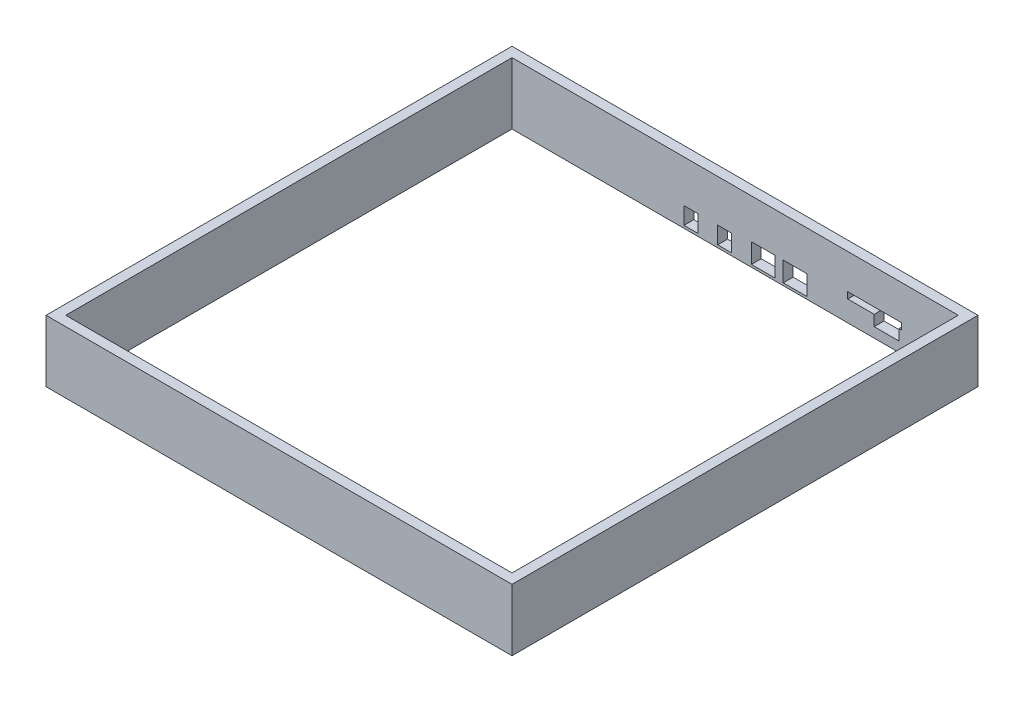
ISO-10303-21;
HEADER;
FILE_DESCRIPTION(('STEP AP214'),'2;1');
FILE_NAME('part.step','',(''),(''),'','','');
FILE_SCHEMA(('AUTOMOTIVE_DESIGN { 1 0 10303 214 1 1 1 1 }'));
ENDSEC;
DATA;
#1=APPLICATION_CONTEXT('core data for automotive mechanical design processes');
#2=APPLICATION_PROTOCOL_DEFINITION('international standard','automotive_design',2000,#1);
#3=PRODUCT_CONTEXT('',#1,'mechanical');
#4=PRODUCT('Part','Part','',(#3));
#5=PRODUCT_RELATED_PRODUCT_CATEGORY('part','',(#4));
#6=PRODUCT_DEFINITION_FORMATION('','',#4);
#7=PRODUCT_DEFINITION_CONTEXT('part definition',#1,'design');
#8=PRODUCT_DEFINITION('design','',#6,#7);
#9=PRODUCT_DEFINITION_SHAPE('','',#8);
#10=(LENGTH_UNIT() NAMED_UNIT(*) SI_UNIT(.MILLI.,.METRE.));
#11=(NAMED_UNIT(*) PLANE_ANGLE_UNIT() SI_UNIT($,.RADIAN.));
#12=(NAMED_UNIT(*) SI_UNIT($,.STERADIAN.) SOLID_ANGLE_UNIT());
#13=UNCERTAINTY_MEASURE_WITH_UNIT(LENGTH_MEASURE(1.E-05),#10,'distance_accuracy_value','');
#14=(GEOMETRIC_REPRESENTATION_CONTEXT(3) GLOBAL_UNCERTAINTY_ASSIGNED_CONTEXT((#13)) GLOBAL_UNIT_ASSIGNED_CONTEXT((#10,
#11,#12)) REPRESENTATION_CONTEXT('',''));
#15=CARTESIAN_POINT('',(0.,0.,0.));
#16=DIRECTION('',(0.,0.,1.));
#17=DIRECTION('',(1.,0.,0.));
#18=AXIS2_PLACEMENT_3D('',#15,#16,#17);
#19=CARTESIAN_POINT('',(-150.,39.8272,-150.));
#20=DIRECTION('',(0.,0.,1.));
#21=DIRECTION('',(1.,0.,0.));
#22=AXIS2_PLACEMENT_3D('',#19,#20,#21);
#23=PLANE('',#22);
#24=DIRECTION('',(0.,-1.,0.));
#25=VECTOR('',#24,1.);
#26=CARTESIAN_POINT('',(-32.9574289216493,12.6748,-150.));
#27=LINE('',#26,#25);
#28=CARTESIAN_POINT('',(-32.9574289216493,12.6748,-150.));
#29=VERTEX_POINT('',#28);
#30=CARTESIAN_POINT('',(-32.9574289216493,1.67480000000004,-150.));
#31=VERTEX_POINT('',#30);
#32=EDGE_CURVE('E488',#29,#31,#27,.T.);
#33=ORIENTED_EDGE('',*,*,#32,.T.);
#34=DIRECTION('',(-1.,0.,0.));
#35=VECTOR('',#34,1.);
#36=CARTESIAN_POINT('',(-23.9574289216493,1.67480000000004,-150.));
#37=LINE('',#36,#35);
#38=CARTESIAN_POINT('',(-23.9574289216493,1.67480000000004,-150.));
#39=VERTEX_POINT('',#38);
#40=EDGE_CURVE('E56',#39,#31,#37,.T.);
#41=ORIENTED_EDGE('',*,*,#40,.F.);
#42=DIRECTION('',(0.,-1.,0.));
#43=VECTOR('',#42,1.);
#44=CARTESIAN_POINT('',(-23.9574289216493,12.6748,-150.));
#45=LINE('',#44,#43);
#46=CARTESIAN_POINT('',(-23.9574289216493,12.6748,-150.));
#47=VERTEX_POINT('',#46);
#48=EDGE_CURVE('E473',#47,#39,#45,.T.);
#49=ORIENTED_EDGE('',*,*,#48,.F.);
#50=DIRECTION('',(-1.,0.,0.));
#51=VECTOR('',#50,1.);
#52=CARTESIAN_POINT('',(-23.9574289216493,12.6748,-150.));
#53=LINE('',#52,#51);
#54=EDGE_CURVE('E484',#47,#29,#53,.T.);
#55=ORIENTED_EDGE('',*,*,#54,.T.);
#56=EDGE_LOOP('',(#33,#41,#49,#55));
#57=FACE_BOUND('',#56,.T.);
#58=DIRECTION('',(0.,-1.,0.));
#59=VECTOR('',#58,1.);
#60=CARTESIAN_POINT('',(30.9684484780568,0.,-150.));
#61=LINE('',#60,#59);
#62=CARTESIAN_POINT('',(30.9684484780568,14.2748,-150.));
#63=VERTEX_POINT('',#62);
#64=CARTESIAN_POINT('',(30.9684484780568,1.5748,-150.));
#65=VERTEX_POINT('',#64);
#66=EDGE_CURVE('E325',#63,#65,#61,.T.);
#67=ORIENTED_EDGE('',*,*,#66,.T.);
#68=DIRECTION('',(-1.,0.,0.));
#69=VECTOR('',#68,1.);
#70=CARTESIAN_POINT('',(0.,1.5748,-150.));
#71=LINE('',#70,#69);
#72=CARTESIAN_POINT('',(46.2684484780568,1.5748,-150.));
#73=VERTEX_POINT('',#72);
#74=EDGE_CURVE('E309',#73,#65,#71,.T.);
#75=ORIENTED_EDGE('',*,*,#74,.F.);
#76=DIRECTION('',(0.,-1.,0.));
#77=VECTOR('',#76,1.);
#78=CARTESIAN_POINT('',(46.2684484780568,0.,-150.));
#79=LINE('',#78,#77);
#80=CARTESIAN_POINT('',(46.2684484780568,14.2748,-150.));
#81=VERTEX_POINT('',#80);
#82=EDGE_CURVE('E1004',#81,#73,#79,.T.);
#83=ORIENTED_EDGE('',*,*,#82,.F.);
#84=DIRECTION('',(-1.,0.,0.));
#85=VECTOR('',#84,1.);
#86=CARTESIAN_POINT('',(0.,14.2748,-150.));
#87=LINE('',#86,#85);
#88=EDGE_CURVE('E1007',#81,#63,#87,.T.);
#89=ORIENTED_EDGE('',*,*,#88,.T.);
#90=EDGE_LOOP('',(#67,#75,#83,#89));
#91=FACE_BOUND('',#90,.T.);
#92=DIRECTION('',(-1.,0.,0.));
#93=VECTOR('',#92,1.);
#94=CARTESIAN_POINT('',(-150.,0.,-150.));
#95=LINE('',#94,#93);
#96=CARTESIAN_POINT('',(150.,0.,-150.));
#97=VERTEX_POINT('',#96);
#98=CARTESIAN_POINT('',(-150.,0.,-150.));
#99=VERTEX_POINT('',#98);
#100=EDGE_CURVE('E609',#97,#99,#95,.T.);
#101=ORIENTED_EDGE('',*,*,#100,.T.);
#102=DIRECTION('',(0.,-1.,0.));
#103=VECTOR('',#102,1.);
#104=CARTESIAN_POINT('',(-150.,39.8272,-150.));
#105=LINE('',#104,#103);
#106=CARTESIAN_POINT('',(-150.,39.8272,-150.));
#107=VERTEX_POINT('',#106);
#108=EDGE_CURVE('E47',#107,#99,#105,.T.);
#109=ORIENTED_EDGE('',*,*,#108,.F.);
#110=DIRECTION('',(-1.,0.,0.));
#111=VECTOR('',#110,1.);
#112=CARTESIAN_POINT('',(-150.,39.8272,-150.));
#113=LINE('',#112,#111);
#114=CARTESIAN_POINT('',(150.,39.8272,-150.));
#115=VERTEX_POINT('',#114);
#116=EDGE_CURVE('E595',#115,#107,#113,.T.);
#117=ORIENTED_EDGE('',*,*,#116,.F.);
#118=DIRECTION('',(0.,-1.,0.));
#119=VECTOR('',#118,1.);
#120=CARTESIAN_POINT('',(150.,39.8272,-150.));
#121=LINE('',#120,#119);
#122=EDGE_CURVE('E11',#115,#97,#121,.T.);
#123=ORIENTED_EDGE('',*,*,#122,.T.);
#124=EDGE_LOOP('',(#101,#109,#117,#123));
#125=FACE_BOUND('',#124,.T.);
#126=DIRECTION('',(0.,-1.,0.));
#127=VECTOR('',#126,1.);
#128=CARTESIAN_POINT('',(10.4425710783508,0.,-150.));
#129=LINE('',#128,#127);
#130=CARTESIAN_POINT('',(10.4425710783508,14.2748,-150.));
#131=VERTEX_POINT('',#130);
#132=CARTESIAN_POINT('',(10.4425710783508,1.5748,-150.));
#133=VERTEX_POINT('',#132);
#134=EDGE_CURVE('E515',#131,#133,#129,.T.);
#135=ORIENTED_EDGE('',*,*,#134,.T.);
#136=DIRECTION('',(-1.,0.,0.));
#137=VECTOR('',#136,1.);
#138=CARTESIAN_POINT('',(0.,1.5748,-150.));
#139=LINE('',#138,#137);
#140=CARTESIAN_POINT('',(25.7425710783508,1.5748,-150.));
#141=VERTEX_POINT('',#140);
#142=EDGE_CURVE('E527',#141,#133,#139,.T.);
#143=ORIENTED_EDGE('',*,*,#142,.F.);
#144=DIRECTION('',(0.,-1.,0.));
#145=VECTOR('',#144,1.);
#146=CARTESIAN_POINT('',(25.7425710783508,0.,-150.));
#147=LINE('',#146,#145);
#148=CARTESIAN_POINT('',(25.7425710783508,14.2748,-150.));
#149=VERTEX_POINT('',#148);
#150=EDGE_CURVE('E523',#149,#141,#147,.T.);
#151=ORIENTED_EDGE('',*,*,#150,.F.);
#152=DIRECTION('',(-1.,0.,0.));
#153=VECTOR('',#152,1.);
#154=CARTESIAN_POINT('',(0.,14.2748,-150.));
#155=LINE('',#154,#153);
#156=EDGE_CURVE('E519',#149,#131,#155,.T.);
#157=ORIENTED_EDGE('',*,*,#156,.T.);
#158=EDGE_LOOP('',(#135,#143,#151,#157));
#159=FACE_BOUND('',#158,.T.);
#160=DIRECTION('',(0.,-1.,0.));
#161=VECTOR('',#160,1.);
#162=CARTESIAN_POINT('',(107.152019667205,0.,-150.));
#163=LINE('',#162,#161);
#164=CARTESIAN_POINT('',(107.152019667205,17.418810742305,-150.));
#165=VERTEX_POINT('',#164);
#166=CARTESIAN_POINT('',(107.152019667205,13.305953258215,-150.));
#167=VERTEX_POINT('',#166);
#168=EDGE_CURVE('E398',#165,#167,#163,.T.);
#169=ORIENTED_EDGE('',*,*,#168,.F.);
#170=DIRECTION('',(1.,0.,0.));
#171=VECTOR('',#170,1.);
#172=CARTESIAN_POINT('',(0.,17.418810742305,-150.));
#173=LINE('',#172,#171);
#174=CARTESIAN_POINT('',(72.497624125665,17.418810742305,-150.));
#175=VERTEX_POINT('',#174);
#176=EDGE_CURVE('E348',#175,#165,#173,.T.);
#177=ORIENTED_EDGE('',*,*,#176,.F.);
#178=DIRECTION('',(-1.58589503645686E-13,-1.,0.));
#179=VECTOR('',#178,1.);
#180=CARTESIAN_POINT('',(72.4976241256623,-1.14973622255803E-11,-150.));
#181=LINE('',#180,#179);
#182=CARTESIAN_POINT('',(72.4976241256644,13.305953258215,-150.));
#183=VERTEX_POINT('',#182);
#184=EDGE_CURVE('E368',#175,#183,#181,.T.);
#185=ORIENTED_EDGE('',*,*,#184,.T.);
#186=DIRECTION('',(1.,0.,0.));
#187=VECTOR('',#186,1.);
#188=CARTESIAN_POINT('',(0.,13.305953258215,-150.));
#189=LINE('',#188,#187);
#190=CARTESIAN_POINT('',(89.515624125665,13.305953258215,-150.));
#191=VERTEX_POINT('',#190);
#192=EDGE_CURVE('E369',#183,#191,#189,.T.);
#193=ORIENTED_EDGE('',*,*,#192,.T.);
#194=DIRECTION('',(0.,1.,0.));
#195=VECTOR('',#194,1.);
#196=CARTESIAN_POINT('',(89.515624125665,0.,-150.));
#197=LINE('',#196,#195);
#198=CARTESIAN_POINT('',(89.515624125665,6.40079999999997,-150.));
#199=VERTEX_POINT('',#198);
#200=EDGE_CURVE('E392',#199,#191,#197,.T.);
#201=ORIENTED_EDGE('',*,*,#200,.F.);
#202=DIRECTION('',(1.,0.,0.));
#203=VECTOR('',#202,1.);
#204=CARTESIAN_POINT('',(0.,6.40079999999998,-150.));
#205=LINE('',#204,#203);
#206=CARTESIAN_POINT('',(105.517624125665,6.40079999999997,-150.));
#207=VERTEX_POINT('',#206);
#208=EDGE_CURVE('E357',#199,#207,#205,.T.);
#209=ORIENTED_EDGE('',*,*,#208,.T.);
#210=DIRECTION('',(0.,1.,0.));
#211=VECTOR('',#210,1.);
#212=CARTESIAN_POINT('',(105.517624125665,0.,-150.));
#213=LINE('',#212,#211);
#214=CARTESIAN_POINT('',(105.517624125665,13.305953258215,-150.));
#215=VERTEX_POINT('',#214);
#216=EDGE_CURVE('E352',#207,#215,#213,.T.);
#217=ORIENTED_EDGE('',*,*,#216,.T.);
#218=DIRECTION('',(1.,0.,0.));
#219=VECTOR('',#218,1.);
#220=CARTESIAN_POINT('',(0.,13.305953258215,-150.));
#221=LINE('',#220,#219);
#222=EDGE_CURVE('E353',#215,#167,#221,.T.);
#223=ORIENTED_EDGE('',*,*,#222,.T.);
#224=EDGE_LOOP('',(#169,#177,#185,#193,#201,#209,#217,#223));
#225=FACE_BOUND('',#224,.T.);
#226=DIRECTION('',(-1.,0.,0.));
#227=VECTOR('',#226,1.);
#228=CARTESIAN_POINT('',(-2.25742892164925,12.6748,-150.));
#229=LINE('',#228,#227);
#230=CARTESIAN_POINT('',(-2.25742892164926,12.6748,-150.));
#231=VERTEX_POINT('',#230);
#232=CARTESIAN_POINT('',(-11.2574289216493,12.6748,-150.));
#233=VERTEX_POINT('',#232);
#234=EDGE_CURVE('E67',#231,#233,#229,.T.);
#235=ORIENTED_EDGE('',*,*,#234,.T.);
#236=DIRECTION('',(0.,1.,0.));
#237=VECTOR('',#236,1.);
#238=CARTESIAN_POINT('',(-11.2574289216493,1.67480000000004,-150.));
#239=LINE('',#238,#237);
#240=CARTESIAN_POINT('',(-11.2574289216493,1.67480000000004,-150.));
#241=VERTEX_POINT('',#240);
#242=EDGE_CURVE('E448',#241,#233,#239,.T.);
#243=ORIENTED_EDGE('',*,*,#242,.F.);
#244=DIRECTION('',(-1.,0.,0.));
#245=VECTOR('',#244,1.);
#246=CARTESIAN_POINT('',(-2.25742892164925,1.67480000000004,-150.));
#247=LINE('',#246,#245);
#248=CARTESIAN_POINT('',(-2.25742892164925,1.67480000000004,-150.));
#249=VERTEX_POINT('',#248);
#250=EDGE_CURVE('E444',#249,#241,#247,.T.);
#251=ORIENTED_EDGE('',*,*,#250,.F.);
#252=DIRECTION('',(0.,1.,0.));
#253=VECTOR('',#252,1.);
#254=CARTESIAN_POINT('',(-2.25742892164925,1.67480000000004,-150.));
#255=LINE('',#254,#253);
#256=EDGE_CURVE('E440',#249,#231,#255,.T.);
#257=ORIENTED_EDGE('',*,*,#256,.T.);
#258=EDGE_LOOP('',(#235,#243,#251,#257));
#259=FACE_BOUND('',#258,.T.);
#260=ADVANCED_FACE('F38',(#57,#91,#125,#159,#225,#259),#23,.F.);
#261=CARTESIAN_POINT('',(-143.65,39.8272,-143.65));
#262=DIRECTION('',(0.,0.,1.));
#263=DIRECTION('',(1.,0.,0.));
#264=AXIS2_PLACEMENT_3D('',#261,#262,#263);
#265=PLANE('',#264);
#266=DIRECTION('',(-1.,0.,0.));
#267=VECTOR('',#266,1.);
#268=CARTESIAN_POINT('',(-23.9574289216493,1.67480000000004,-143.65));
#269=LINE('',#268,#267);
#270=CARTESIAN_POINT('',(-23.9574289216493,1.67480000000004,-143.65));
#271=VERTEX_POINT('',#270);
#272=CARTESIAN_POINT('',(-32.9574289216493,1.67480000000004,-143.65));
#273=VERTEX_POINT('',#272);
#274=EDGE_CURVE('E494',#271,#273,#269,.T.);
#275=ORIENTED_EDGE('',*,*,#274,.T.);
#276=DIRECTION('',(0.,-1.,0.));
#277=VECTOR('',#276,1.);
#278=CARTESIAN_POINT('',(-32.9574289216493,12.6748,-143.65));
#279=LINE('',#278,#277);
#280=CARTESIAN_POINT('',(-32.9574289216493,12.6748,-143.65));
#281=VERTEX_POINT('',#280);
#282=EDGE_CURVE('E465',#281,#273,#279,.T.);
#283=ORIENTED_EDGE('',*,*,#282,.F.);
#284=DIRECTION('',(-1.,0.,0.));
#285=VECTOR('',#284,1.);
#286=CARTESIAN_POINT('',(-23.9574289216493,12.6748,-143.65));
#287=LINE('',#286,#285);
#288=CARTESIAN_POINT('',(-23.9574289216493,12.6748,-143.65));
#289=VERTEX_POINT('',#288);
#290=EDGE_CURVE('E428',#289,#281,#287,.T.);
#291=ORIENTED_EDGE('',*,*,#290,.F.);
#292=DIRECTION('',(0.,-1.,0.));
#293=VECTOR('',#292,1.);
#294=CARTESIAN_POINT('',(-23.9574289216493,12.6748,-143.65));
#295=LINE('',#294,#293);
#296=EDGE_CURVE('E498',#289,#271,#295,.T.);
#297=ORIENTED_EDGE('',*,*,#296,.T.);
#298=EDGE_LOOP('',(#275,#283,#291,#297));
#299=FACE_BOUND('',#298,.T.);
#300=DIRECTION('',(1.,0.,0.));
#301=VECTOR('',#300,1.);
#302=CARTESIAN_POINT('',(0.,17.418810742305,-143.65));
#303=LINE('',#302,#301);
#304=CARTESIAN_POINT('',(72.497624125665,17.418810742305,-143.65));
#305=VERTEX_POINT('',#304);
#306=CARTESIAN_POINT('',(107.152019667205,17.418810742305,-143.65));
#307=VERTEX_POINT('',#306);
#308=EDGE_CURVE('E342',#305,#307,#303,.T.);
#309=ORIENTED_EDGE('',*,*,#308,.T.);
#310=DIRECTION('',(0.,-1.,0.));
#311=VECTOR('',#310,1.);
#312=CARTESIAN_POINT('',(107.152019667205,0.,-143.65));
#313=LINE('',#312,#311);
#314=CARTESIAN_POINT('',(107.152019667205,13.305953258215,-143.65));
#315=VERTEX_POINT('',#314);
#316=EDGE_CURVE('E347',#307,#315,#313,.T.);
#317=ORIENTED_EDGE('',*,*,#316,.T.);
#318=DIRECTION('',(1.,0.,0.));
#319=VECTOR('',#318,1.);
#320=CARTESIAN_POINT('',(0.,13.305953258215,-143.65));
#321=LINE('',#320,#319);
#322=CARTESIAN_POINT('',(105.517624125665,13.305953258215,-143.65));
#323=VERTEX_POINT('',#322);
#324=EDGE_CURVE('E372',#323,#315,#321,.T.);
#325=ORIENTED_EDGE('',*,*,#324,.F.);
#326=DIRECTION('',(0.,1.,0.));
#327=VECTOR('',#326,1.);
#328=CARTESIAN_POINT('',(105.517624125665,0.,-143.65));
#329=LINE('',#328,#327);
#330=CARTESIAN_POINT('',(105.517624125665,6.40079999999997,-143.65));
#331=VERTEX_POINT('',#330);
#332=EDGE_CURVE('E376',#331,#323,#329,.T.);
#333=ORIENTED_EDGE('',*,*,#332,.F.);
#334=DIRECTION('',(1.,0.,0.));
#335=VECTOR('',#334,1.);
#336=CARTESIAN_POINT('',(0.,6.40079999999998,-143.65));
#337=LINE('',#336,#335);
#338=CARTESIAN_POINT('',(89.515624125665,6.40079999999997,-143.65));
#339=VERTEX_POINT('',#338);
#340=EDGE_CURVE('E380',#339,#331,#337,.T.);
#341=ORIENTED_EDGE('',*,*,#340,.F.);
#342=DIRECTION('',(0.,1.,0.));
#343=VECTOR('',#342,1.);
#344=CARTESIAN_POINT('',(89.515624125665,0.,-143.65));
#345=LINE('',#344,#343);
#346=CARTESIAN_POINT('',(89.515624125665,13.305953258215,-143.65));
#347=VERTEX_POINT('',#346);
#348=EDGE_CURVE('E364',#339,#347,#345,.T.);
#349=ORIENTED_EDGE('',*,*,#348,.T.);
#350=DIRECTION('',(1.,0.,0.));
#351=VECTOR('',#350,1.);
#352=CARTESIAN_POINT('',(0.,13.305953258215,-143.65));
#353=LINE('',#352,#351);
#354=CARTESIAN_POINT('',(72.4976241256644,13.305953258215,-143.65));
#355=VERTEX_POINT('',#354);
#356=EDGE_CURVE('E383',#355,#347,#353,.T.);
#357=ORIENTED_EDGE('',*,*,#356,.F.);
#358=DIRECTION('',(-1.58589503645686E-13,-1.,0.));
#359=VECTOR('',#358,1.);
#360=CARTESIAN_POINT('',(72.4976241256623,-1.14973622255803E-11,-143.65));
#361=LINE('',#360,#359);
#362=EDGE_CURVE('E389',#305,#355,#361,.T.);
#363=ORIENTED_EDGE('',*,*,#362,.F.);
#364=EDGE_LOOP('',(#309,#317,#325,#333,#341,#349,#357,#363));
#365=FACE_BOUND('',#364,.T.);
#366=DIRECTION('',(-1.,0.,0.));
#367=VECTOR('',#366,1.);
#368=CARTESIAN_POINT('',(-143.65,0.,-143.65));
#369=LINE('',#368,#367);
#370=CARTESIAN_POINT('',(143.65,0.,-143.65));
#371=VERTEX_POINT('',#370);
#372=CARTESIAN_POINT('',(-143.65,0.,-143.65));
#373=VERTEX_POINT('',#372);
#374=EDGE_CURVE('E567',#371,#373,#369,.T.);
#375=ORIENTED_EDGE('',*,*,#374,.F.);
#376=DIRECTION('',(0.,-1.,0.));
#377=VECTOR('',#376,1.);
#378=CARTESIAN_POINT('',(143.65,39.8272,-143.65));
#379=LINE('',#378,#377);
#380=CARTESIAN_POINT('',(143.65,39.8272,-143.65));
#381=VERTEX_POINT('',#380);
#382=EDGE_CURVE('E586',#381,#371,#379,.T.);
#383=ORIENTED_EDGE('',*,*,#382,.F.);
#384=DIRECTION('',(-1.,0.,0.));
#385=VECTOR('',#384,1.);
#386=CARTESIAN_POINT('',(-143.65,39.8272,-143.65));
#387=LINE('',#386,#385);
#388=CARTESIAN_POINT('',(-143.65,39.8272,-143.65));
#389=VERTEX_POINT('',#388);
#390=EDGE_CURVE('E552',#381,#389,#387,.T.);
#391=ORIENTED_EDGE('',*,*,#390,.T.);
#392=DIRECTION('',(0.,-1.,0.));
#393=VECTOR('',#392,1.);
#394=CARTESIAN_POINT('',(-143.65,39.8272,-143.65));
#395=LINE('',#394,#393);
#396=EDGE_CURVE('E583',#389,#373,#395,.T.);
#397=ORIENTED_EDGE('',*,*,#396,.T.);
#398=EDGE_LOOP('',(#375,#383,#391,#397));
#399=FACE_BOUND('',#398,.T.);
#400=DIRECTION('',(-1.,0.,0.));
#401=VECTOR('',#400,1.);
#402=CARTESIAN_POINT('',(0.,1.5748,-143.65));
#403=LINE('',#402,#401);
#404=CARTESIAN_POINT('',(25.7425710783508,1.5748,-143.65));
#405=VERTEX_POINT('',#404);
#406=CARTESIAN_POINT('',(10.4425710783508,1.5748,-143.65));
#407=VERTEX_POINT('',#406);
#408=EDGE_CURVE('E507',#405,#407,#403,.T.);
#409=ORIENTED_EDGE('',*,*,#408,.T.);
#410=DIRECTION('',(0.,-1.,0.));
#411=VECTOR('',#410,1.);
#412=CARTESIAN_POINT('',(10.4425710783508,0.,-143.65));
#413=LINE('',#412,#411);
#414=CARTESIAN_POINT('',(10.4425710783508,14.2748,-143.65));
#415=VERTEX_POINT('',#414);
#416=EDGE_CURVE('E511',#415,#407,#413,.T.);
#417=ORIENTED_EDGE('',*,*,#416,.F.);
#418=DIRECTION('',(-1.,0.,0.));
#419=VECTOR('',#418,1.);
#420=CARTESIAN_POINT('',(0.,14.2748,-143.65));
#421=LINE('',#420,#419);
#422=CARTESIAN_POINT('',(25.7425710783508,14.2748,-143.65));
#423=VERTEX_POINT('',#422);
#424=EDGE_CURVE('E535',#423,#415,#421,.T.);
#425=ORIENTED_EDGE('',*,*,#424,.F.);
#426=DIRECTION('',(0.,-1.,0.));
#427=VECTOR('',#426,1.);
#428=CARTESIAN_POINT('',(25.7425710783508,0.,-143.65));
#429=LINE('',#428,#427);
#430=EDGE_CURVE('E334',#423,#405,#429,.T.);
#431=ORIENTED_EDGE('',*,*,#430,.T.);
#432=EDGE_LOOP('',(#409,#417,#425,#431));
#433=FACE_BOUND('',#432,.T.);
#434=DIRECTION('',(-1.,0.,0.));
#435=VECTOR('',#434,1.);
#436=CARTESIAN_POINT('',(0.,1.5748,-143.65));
#437=LINE('',#436,#435);
#438=CARTESIAN_POINT('',(46.2684484780568,1.5748,-143.65));
#439=VERTEX_POINT('',#438);
#440=CARTESIAN_POINT('',(30.9684484780568,1.5748,-143.65));
#441=VERTEX_POINT('',#440);
#442=EDGE_CURVE('E306',#439,#441,#437,.T.);
#443=ORIENTED_EDGE('',*,*,#442,.T.);
#444=DIRECTION('',(0.,-1.,0.));
#445=VECTOR('',#444,1.);
#446=CARTESIAN_POINT('',(30.9684484780568,0.,-143.65));
#447=LINE('',#446,#445);
#448=CARTESIAN_POINT('',(30.9684484780568,14.2748,-143.65));
#449=VERTEX_POINT('',#448);
#450=EDGE_CURVE('E317',#449,#441,#447,.T.);
#451=ORIENTED_EDGE('',*,*,#450,.F.);
#452=DIRECTION('',(-1.,0.,0.));
#453=VECTOR('',#452,1.);
#454=CARTESIAN_POINT('',(0.,14.2748,-143.65));
#455=LINE('',#454,#453);
#456=CARTESIAN_POINT('',(46.2684484780568,14.2748,-143.65));
#457=VERTEX_POINT('',#456);
#458=EDGE_CURVE('E314',#457,#449,#455,.T.);
#459=ORIENTED_EDGE('',*,*,#458,.F.);
#460=DIRECTION('',(0.,-1.,0.));
#461=VECTOR('',#460,1.);
#462=CARTESIAN_POINT('',(46.2684484780568,0.,-143.65));
#463=LINE('',#462,#461);
#464=EDGE_CURVE('E329',#457,#439,#463,.T.);
#465=ORIENTED_EDGE('',*,*,#464,.T.);
#466=EDGE_LOOP('',(#443,#451,#459,#465));
#467=FACE_BOUND('',#466,.T.);
#468=DIRECTION('',(0.,1.,0.));
#469=VECTOR('',#468,1.);
#470=CARTESIAN_POINT('',(-11.2574289216493,1.67480000000004,-143.65));
#471=LINE('',#470,#469);
#472=CARTESIAN_POINT('',(-11.2574289216493,1.67480000000004,-143.65));
#473=VERTEX_POINT('',#472);
#474=CARTESIAN_POINT('',(-11.2574289216493,12.6748,-143.65));
#475=VERTEX_POINT('',#474);
#476=EDGE_CURVE('E458',#473,#475,#471,.T.);
#477=ORIENTED_EDGE('',*,*,#476,.T.);
#478=DIRECTION('',(-1.,0.,0.));
#479=VECTOR('',#478,1.);
#480=CARTESIAN_POINT('',(-2.25742892164925,12.6748,-143.65));
#481=LINE('',#480,#479);
#482=CARTESIAN_POINT('',(-2.25742892164925,12.6748,-143.65));
#483=VERTEX_POINT('',#482);
#484=EDGE_CURVE('E454',#483,#475,#481,.T.);
#485=ORIENTED_EDGE('',*,*,#484,.F.);
#486=DIRECTION('',(0.,1.,0.));
#487=VECTOR('',#486,1.);
#488=CARTESIAN_POINT('',(-2.25742892164925,1.67480000000004,-143.65));
#489=LINE('',#488,#487);
#490=CARTESIAN_POINT('',(-2.25742892164926,1.67480000000004,-143.65));
#491=VERTEX_POINT('',#490);
#492=EDGE_CURVE('E423',#491,#483,#489,.T.);
#493=ORIENTED_EDGE('',*,*,#492,.F.);
#494=DIRECTION('',(-1.,0.,0.));
#495=VECTOR('',#494,1.);
#496=CARTESIAN_POINT('',(-2.25742892164925,1.67480000000004,-143.65));
#497=LINE('',#496,#495);
#498=EDGE_CURVE('E377',#491,#473,#497,.T.);
#499=ORIENTED_EDGE('',*,*,#498,.T.);
#500=EDGE_LOOP('',(#477,#485,#493,#499));
#501=FACE_BOUND('',#500,.T.);
#502=ADVANCED_FACE('F327',(#299,#365,#399,#433,#467,#501),#265,.T.);
#503=CARTESIAN_POINT('',(0.,39.8272,0.));
#504=DIRECTION('',(0.,-1.,0.));
#505=DIRECTION('',(0.,0.,-1.));
#506=AXIS2_PLACEMENT_3D('',#503,#504,#505);
#507=PLANE('',#506);
#508=DIRECTION('',(0.,0.,-1.));
#509=VECTOR('',#508,1.);
#510=CARTESIAN_POINT('',(150.,39.8272,150.));
#511=LINE('',#510,#509);
#512=CARTESIAN_POINT('',(150.,39.8272,150.));
#513=VERTEX_POINT('',#512);
#514=EDGE_CURVE('E591',#513,#115,#511,.T.);
#515=ORIENTED_EDGE('',*,*,#514,.T.);
#516=ORIENTED_EDGE('',*,*,#116,.T.);
#517=DIRECTION('',(0.,0.,1.));
#518=VECTOR('',#517,1.);
#519=CARTESIAN_POINT('',(-150.,39.8272,150.));
#520=LINE('',#519,#518);
#521=CARTESIAN_POINT('',(-150.,39.8272,150.));
#522=VERTEX_POINT('',#521);
#523=EDGE_CURVE('E599',#107,#522,#520,.T.);
#524=ORIENTED_EDGE('',*,*,#523,.T.);
#525=DIRECTION('',(1.,0.,0.));
#526=VECTOR('',#525,1.);
#527=CARTESIAN_POINT('',(-150.,39.8272,150.));
#528=LINE('',#527,#526);
#529=EDGE_CURVE('E602',#522,#513,#528,.T.);
#530=ORIENTED_EDGE('',*,*,#529,.T.);
#531=EDGE_LOOP('',(#515,#516,#524,#530));
#532=FACE_BOUND('',#531,.T.);
#533=DIRECTION('',(0.,0.,-1.));
#534=VECTOR('',#533,1.);
#535=CARTESIAN_POINT('',(143.65,39.8272,143.65));
#536=LINE('',#535,#534);
#537=CARTESIAN_POINT('',(143.65,39.8272,143.65));
#538=VERTEX_POINT('',#537);
#539=EDGE_CURVE('E549',#538,#381,#536,.T.);
#540=ORIENTED_EDGE('',*,*,#539,.F.);
#541=DIRECTION('',(1.,0.,0.));
#542=VECTOR('',#541,1.);
#543=CARTESIAN_POINT('',(-143.65,39.8272,143.65));
#544=LINE('',#543,#542);
#545=CARTESIAN_POINT('',(-143.65,39.8272,143.65));
#546=VERTEX_POINT('',#545);
#547=EDGE_CURVE('E560',#546,#538,#544,.T.);
#548=ORIENTED_EDGE('',*,*,#547,.F.);
#549=DIRECTION('',(0.,0.,1.));
#550=VECTOR('',#549,1.);
#551=CARTESIAN_POINT('',(-143.65,39.8272,143.65));
#552=LINE('',#551,#550);
#553=EDGE_CURVE('E556',#389,#546,#552,.T.);
#554=ORIENTED_EDGE('',*,*,#553,.F.);
#555=ORIENTED_EDGE('',*,*,#390,.F.);
#556=EDGE_LOOP('',(#540,#548,#554,#555));
#557=FACE_BOUND('',#556,.T.);
#558=ADVANCED_FACE('F643',(#532,#557),#507,.F.);
#559=CARTESIAN_POINT('',(0.,0.,0.));
#560=DIRECTION('',(0.,-1.,0.));
#561=DIRECTION('',(0.,0.,-1.));
#562=AXIS2_PLACEMENT_3D('',#559,#560,#561);
#563=PLANE('',#562);
#564=DIRECTION('',(0.,0.,-1.));
#565=VECTOR('',#564,1.);
#566=CARTESIAN_POINT('',(150.,0.,150.));
#567=LINE('',#566,#565);
#568=CARTESIAN_POINT('',(150.,0.,150.));
#569=VERTEX_POINT('',#568);
#570=EDGE_CURVE('E590',#569,#97,#567,.T.);
#571=ORIENTED_EDGE('',*,*,#570,.F.);
#572=DIRECTION('',(1.,0.,0.));
#573=VECTOR('',#572,1.);
#574=CARTESIAN_POINT('',(-150.,0.,150.));
#575=LINE('',#574,#573);
#576=CARTESIAN_POINT('',(-150.,0.,150.));
#577=VERTEX_POINT('',#576);
#578=EDGE_CURVE('E596',#577,#569,#575,.T.);
#579=ORIENTED_EDGE('',*,*,#578,.F.);
#580=DIRECTION('',(0.,0.,1.));
#581=VECTOR('',#580,1.);
#582=CARTESIAN_POINT('',(-150.,0.,150.));
#583=LINE('',#582,#581);
#584=EDGE_CURVE('E612',#99,#577,#583,.T.);
#585=ORIENTED_EDGE('',*,*,#584,.F.);
#586=ORIENTED_EDGE('',*,*,#100,.F.);
#587=EDGE_LOOP('',(#571,#579,#585,#586));
#588=FACE_BOUND('',#587,.T.);
#589=DIRECTION('',(1.,0.,0.));
#590=VECTOR('',#589,1.);
#591=CARTESIAN_POINT('',(-143.65,0.,143.65));
#592=LINE('',#591,#590);
#593=CARTESIAN_POINT('',(-143.65,0.,143.65));
#594=VERTEX_POINT('',#593);
#595=CARTESIAN_POINT('',(143.65,0.,143.65));
#596=VERTEX_POINT('',#595);
#597=EDGE_CURVE('E553',#594,#596,#592,.T.);
#598=ORIENTED_EDGE('',*,*,#597,.T.);
#599=DIRECTION('',(0.,0.,-1.));
#600=VECTOR('',#599,1.);
#601=CARTESIAN_POINT('',(143.65,0.,143.65));
#602=LINE('',#601,#600);
#603=EDGE_CURVE('E548',#596,#371,#602,.T.);
#604=ORIENTED_EDGE('',*,*,#603,.T.);
#605=ORIENTED_EDGE('',*,*,#374,.T.);
#606=DIRECTION('',(0.,0.,1.));
#607=VECTOR('',#606,1.);
#608=CARTESIAN_POINT('',(-143.65,0.,143.65));
#609=LINE('',#608,#607);
#610=EDGE_CURVE('E571',#373,#594,#609,.T.);
#611=ORIENTED_EDGE('',*,*,#610,.T.);
#612=EDGE_LOOP('',(#598,#604,#605,#611));
#613=FACE_BOUND('',#612,.T.);
#614=ADVANCED_FACE('F633',(#588,#613),#563,.T.);
#615=CARTESIAN_POINT('',(150.,39.8272,150.));
#616=DIRECTION('',(-1.,0.,0.));
#617=DIRECTION('',(0.,0.,1.));
#618=AXIS2_PLACEMENT_3D('',#615,#616,#617);
#619=PLANE('',#618);
#620=ORIENTED_EDGE('',*,*,#570,.T.);
#621=ORIENTED_EDGE('',*,*,#122,.F.);
#622=ORIENTED_EDGE('',*,*,#514,.F.);
#623=DIRECTION('',(0.,-1.,0.));
#624=VECTOR('',#623,1.);
#625=CARTESIAN_POINT('',(150.,39.8272,150.));
#626=LINE('',#625,#624);
#627=EDGE_CURVE('E605',#513,#569,#626,.T.);
#628=ORIENTED_EDGE('',*,*,#627,.T.);
#629=EDGE_LOOP('',(#620,#621,#622,#628));
#630=FACE_BOUND('',#629,.T.);
#631=ADVANCED_FACE('F40',(#630),#619,.F.);
#632=CARTESIAN_POINT('',(-150.,39.8272,150.));
#633=DIRECTION('',(1.,0.,0.));
#634=DIRECTION('',(0.,0.,-1.));
#635=AXIS2_PLACEMENT_3D('',#632,#633,#634);
#636=PLANE('',#635);
#637=ORIENTED_EDGE('',*,*,#584,.T.);
#638=DIRECTION('',(0.,-1.,0.));
#639=VECTOR('',#638,1.);
#640=CARTESIAN_POINT('',(-150.,39.8272,150.));
#641=LINE('',#640,#639);
#642=EDGE_CURVE('E620',#522,#577,#641,.T.);
#643=ORIENTED_EDGE('',*,*,#642,.F.);
#644=ORIENTED_EDGE('',*,*,#523,.F.);
#645=ORIENTED_EDGE('',*,*,#108,.T.);
#646=EDGE_LOOP('',(#637,#643,#644,#645));
#647=FACE_BOUND('',#646,.T.);
#648=ADVANCED_FACE('F627',(#647),#636,.F.);
#649=CARTESIAN_POINT('',(-150.,39.8272,150.));
#650=DIRECTION('',(0.,0.,-1.));
#651=DIRECTION('',(-1.,0.,0.));
#652=AXIS2_PLACEMENT_3D('',#649,#650,#651);
#653=PLANE('',#652);
#654=ORIENTED_EDGE('',*,*,#578,.T.);
#655=ORIENTED_EDGE('',*,*,#627,.F.);
#656=ORIENTED_EDGE('',*,*,#529,.F.);
#657=ORIENTED_EDGE('',*,*,#642,.T.);
#658=EDGE_LOOP('',(#654,#655,#656,#657));
#659=FACE_BOUND('',#658,.T.);
#660=ADVANCED_FACE('F637',(#659),#653,.F.);
#661=CARTESIAN_POINT('',(143.65,39.8272,143.65));
#662=DIRECTION('',(-1.,0.,0.));
#663=DIRECTION('',(0.,0.,1.));
#664=AXIS2_PLACEMENT_3D('',#661,#662,#663);
#665=PLANE('',#664);
#666=ORIENTED_EDGE('',*,*,#603,.F.);
#667=DIRECTION('',(0.,-1.,0.));
#668=VECTOR('',#667,1.);
#669=CARTESIAN_POINT('',(143.65,39.8272,143.65));
#670=LINE('',#669,#668);
#671=EDGE_CURVE('E563',#538,#596,#670,.T.);
#672=ORIENTED_EDGE('',*,*,#671,.F.);
#673=ORIENTED_EDGE('',*,*,#539,.T.);
#674=ORIENTED_EDGE('',*,*,#382,.T.);
#675=EDGE_LOOP('',(#666,#672,#673,#674));
#676=FACE_BOUND('',#675,.T.);
#677=ADVANCED_FACE('F715',(#676),#665,.T.);
#678=CARTESIAN_POINT('',(-143.65,39.8272,143.65));
#679=DIRECTION('',(1.,0.,0.));
#680=DIRECTION('',(0.,0.,-1.));
#681=AXIS2_PLACEMENT_3D('',#678,#679,#680);
#682=PLANE('',#681);
#683=ORIENTED_EDGE('',*,*,#610,.F.);
#684=ORIENTED_EDGE('',*,*,#396,.F.);
#685=ORIENTED_EDGE('',*,*,#553,.T.);
#686=DIRECTION('',(0.,-1.,0.));
#687=VECTOR('',#686,1.);
#688=CARTESIAN_POINT('',(-143.65,39.8272,143.65));
#689=LINE('',#688,#687);
#690=EDGE_CURVE('E581',#546,#594,#689,.T.);
#691=ORIENTED_EDGE('',*,*,#690,.T.);
#692=EDGE_LOOP('',(#683,#684,#685,#691));
#693=FACE_BOUND('',#692,.T.);
#694=ADVANCED_FACE('F711',(#693),#682,.T.);
#695=CARTESIAN_POINT('',(-143.65,39.8272,143.65));
#696=DIRECTION('',(0.,0.,-1.));
#697=DIRECTION('',(-1.,0.,0.));
#698=AXIS2_PLACEMENT_3D('',#695,#696,#697);
#699=PLANE('',#698);
#700=ORIENTED_EDGE('',*,*,#597,.F.);
#701=ORIENTED_EDGE('',*,*,#690,.F.);
#702=ORIENTED_EDGE('',*,*,#547,.T.);
#703=ORIENTED_EDGE('',*,*,#671,.T.);
#704=EDGE_LOOP('',(#700,#701,#702,#703));
#705=FACE_BOUND('',#704,.T.);
#706=ADVANCED_FACE('F707',(#705),#699,.T.);
#707=CARTESIAN_POINT('',(10.4425710783508,0.,150.001));
#708=DIRECTION('',(1.,0.,0.));
#709=DIRECTION('',(0.,0.,-1.));
#710=AXIS2_PLACEMENT_3D('',#707,#708,#709);
#711=PLANE('',#710);
#712=ORIENTED_EDGE('',*,*,#416,.T.);
#713=DIRECTION('',(0.,0.,-1.));
#714=VECTOR('',#713,1.);
#715=CARTESIAN_POINT('',(10.4425710783508,1.5748,150.001));
#716=LINE('',#715,#714);
#717=EDGE_CURVE('E532',#407,#133,#716,.T.);
#718=ORIENTED_EDGE('',*,*,#717,.T.);
#719=ORIENTED_EDGE('',*,*,#134,.F.);
#720=DIRECTION('',(0.,0.,-1.));
#721=VECTOR('',#720,1.);
#722=CARTESIAN_POINT('',(10.4425710783508,14.2748,150.001));
#723=LINE('',#722,#721);
#724=EDGE_CURVE('E531',#415,#131,#723,.T.);
#725=ORIENTED_EDGE('',*,*,#724,.F.);
#726=EDGE_LOOP('',(#712,#718,#719,#725));
#727=FACE_BOUND('',#726,.T.);
#728=ADVANCED_FACE('F696',(#727),#711,.T.);
#729=CARTESIAN_POINT('',(0.,1.5748,150.001));
#730=DIRECTION('',(0.,-1.,0.));
#731=DIRECTION('',(0.,0.,-1.));
#732=AXIS2_PLACEMENT_3D('',#729,#730,#731);
#733=PLANE('',#732);
#734=DIRECTION('',(0.,0.,-1.));
#735=VECTOR('',#734,1.);
#736=CARTESIAN_POINT('',(25.7425710783508,1.5748,150.001));
#737=LINE('',#736,#735);
#738=EDGE_CURVE('E536',#405,#141,#737,.T.);
#739=ORIENTED_EDGE('',*,*,#738,.T.);
#740=ORIENTED_EDGE('',*,*,#142,.T.);
#741=ORIENTED_EDGE('',*,*,#717,.F.);
#742=ORIENTED_EDGE('',*,*,#408,.F.);
#743=EDGE_LOOP('',(#739,#740,#741,#742));
#744=FACE_BOUND('',#743,.T.);
#745=ADVANCED_FACE('F692',(#744),#733,.F.);
#746=CARTESIAN_POINT('',(25.7425710783508,0.,150.001));
#747=DIRECTION('',(1.,0.,0.));
#748=DIRECTION('',(0.,0.,-1.));
#749=AXIS2_PLACEMENT_3D('',#746,#747,#748);
#750=PLANE('',#749);
#751=DIRECTION('',(0.,0.,-1.));
#752=VECTOR('',#751,1.);
#753=CARTESIAN_POINT('',(25.7425710783508,14.2748,150.001));
#754=LINE('',#753,#752);
#755=EDGE_CURVE('E539',#423,#149,#754,.T.);
#756=ORIENTED_EDGE('',*,*,#755,.T.);
#757=ORIENTED_EDGE('',*,*,#150,.T.);
#758=ORIENTED_EDGE('',*,*,#738,.F.);
#759=ORIENTED_EDGE('',*,*,#430,.F.);
#760=EDGE_LOOP('',(#756,#757,#758,#759));
#761=FACE_BOUND('',#760,.T.);
#762=ADVANCED_FACE('F695',(#761),#750,.F.);
#763=CARTESIAN_POINT('',(0.,14.2748,150.001));
#764=DIRECTION('',(0.,-1.,0.));
#765=DIRECTION('',(0.,0.,-1.));
#766=AXIS2_PLACEMENT_3D('',#763,#764,#765);
#767=PLANE('',#766);
#768=ORIENTED_EDGE('',*,*,#424,.T.);
#769=ORIENTED_EDGE('',*,*,#724,.T.);
#770=ORIENTED_EDGE('',*,*,#156,.F.);
#771=ORIENTED_EDGE('',*,*,#755,.F.);
#772=EDGE_LOOP('',(#768,#769,#770,#771));
#773=FACE_BOUND('',#772,.T.);
#774=ADVANCED_FACE('F700',(#773),#767,.T.);
#775=CARTESIAN_POINT('',(30.9684484780568,0.,150.001));
#776=DIRECTION('',(1.,0.,0.));
#777=DIRECTION('',(0.,0.,-1.));
#778=AXIS2_PLACEMENT_3D('',#775,#776,#777);
#779=PLANE('',#778);
#780=ORIENTED_EDGE('',*,*,#450,.T.);
#781=DIRECTION('',(0.,0.,-1.));
#782=VECTOR('',#781,1.);
#783=CARTESIAN_POINT('',(30.9684484780568,1.5748,150.001));
#784=LINE('',#783,#782);
#785=EDGE_CURVE('E302',#441,#65,#784,.T.);
#786=ORIENTED_EDGE('',*,*,#785,.T.);
#787=ORIENTED_EDGE('',*,*,#66,.F.);
#788=DIRECTION('',(0.,0.,-1.));
#789=VECTOR('',#788,1.);
#790=CARTESIAN_POINT('',(30.9684484780568,14.2748,150.001));
#791=LINE('',#790,#789);
#792=EDGE_CURVE('E320',#449,#63,#791,.T.);
#793=ORIENTED_EDGE('',*,*,#792,.F.);
#794=EDGE_LOOP('',(#780,#786,#787,#793));
#795=FACE_BOUND('',#794,.T.);
#796=ADVANCED_FACE('F318',(#795),#779,.T.);
#797=CARTESIAN_POINT('',(0.,1.5748,150.001));
#798=DIRECTION('',(0.,-1.,0.));
#799=DIRECTION('',(0.,0.,-1.));
#800=AXIS2_PLACEMENT_3D('',#797,#798,#799);
#801=PLANE('',#800);
#802=DIRECTION('',(0.,0.,-1.));
#803=VECTOR('',#802,1.);
#804=CARTESIAN_POINT('',(46.2684484780568,1.5748,150.001));
#805=LINE('',#804,#803);
#806=EDGE_CURVE('E313',#439,#73,#805,.T.);
#807=ORIENTED_EDGE('',*,*,#806,.T.);
#808=ORIENTED_EDGE('',*,*,#74,.T.);
#809=ORIENTED_EDGE('',*,*,#785,.F.);
#810=ORIENTED_EDGE('',*,*,#442,.F.);
#811=EDGE_LOOP('',(#807,#808,#809,#810));
#812=FACE_BOUND('',#811,.T.);
#813=ADVANCED_FACE('F304',(#812),#801,.F.);
#814=CARTESIAN_POINT('',(46.2684484780568,0.,150.001));
#815=DIRECTION('',(1.,0.,0.));
#816=DIRECTION('',(0.,0.,-1.));
#817=AXIS2_PLACEMENT_3D('',#814,#815,#816);
#818=PLANE('',#817);
#819=DIRECTION('',(0.,0.,-1.));
#820=VECTOR('',#819,1.);
#821=CARTESIAN_POINT('',(46.2684484780568,14.2748,150.001));
#822=LINE('',#821,#820);
#823=EDGE_CURVE('E992',#457,#81,#822,.T.);
#824=ORIENTED_EDGE('',*,*,#823,.T.);
#825=ORIENTED_EDGE('',*,*,#82,.T.);
#826=ORIENTED_EDGE('',*,*,#806,.F.);
#827=ORIENTED_EDGE('',*,*,#464,.F.);
#828=EDGE_LOOP('',(#824,#825,#826,#827));
#829=FACE_BOUND('',#828,.T.);
#830=ADVANCED_FACE('F801',(#829),#818,.F.);
#831=CARTESIAN_POINT('',(0.,14.2748,150.001));
#832=DIRECTION('',(0.,-1.,0.));
#833=DIRECTION('',(0.,0.,-1.));
#834=AXIS2_PLACEMENT_3D('',#831,#832,#833);
#835=PLANE('',#834);
#836=ORIENTED_EDGE('',*,*,#458,.T.);
#837=ORIENTED_EDGE('',*,*,#792,.T.);
#838=ORIENTED_EDGE('',*,*,#88,.F.);
#839=ORIENTED_EDGE('',*,*,#823,.F.);
#840=EDGE_LOOP('',(#836,#837,#838,#839));
#841=FACE_BOUND('',#840,.T.);
#842=ADVANCED_FACE('F810',(#841),#835,.T.);
#843=CARTESIAN_POINT('',(0.,17.418810742305,150.001));
#844=DIRECTION('',(0.,1.,0.));
#845=DIRECTION('',(-1.,0.,0.));
#846=AXIS2_PLACEMENT_3D('',#843,#844,#845);
#847=PLANE('',#846);
#848=DIRECTION('',(0.,0.,-1.));
#849=VECTOR('',#848,1.);
#850=CARTESIAN_POINT('',(72.497624125665,17.418810742305,150.001));
#851=LINE('',#850,#849);
#852=EDGE_CURVE('E343',#305,#175,#851,.T.);
#853=ORIENTED_EDGE('',*,*,#852,.T.);
#854=ORIENTED_EDGE('',*,*,#176,.T.);
#855=DIRECTION('',(0.,0.,-1.));
#856=VECTOR('',#855,1.);
#857=CARTESIAN_POINT('',(107.152019667205,17.418810742305,150.001));
#858=LINE('',#857,#856);
#859=EDGE_CURVE('E338',#307,#165,#858,.T.);
#860=ORIENTED_EDGE('',*,*,#859,.F.);
#861=ORIENTED_EDGE('',*,*,#308,.F.);
#862=EDGE_LOOP('',(#853,#854,#860,#861));
#863=FACE_BOUND('',#862,.T.);
#864=ADVANCED_FACE('F820',(#863),#847,.F.);
#865=CARTESIAN_POINT('',(72.4976241256623,-1.14973622255803E-11,150.001));
#866=DIRECTION('',(1.,-1.58589503645686E-13,0.));
#867=DIRECTION('',(1.58589503645686E-13,1.,0.));
#868=AXIS2_PLACEMENT_3D('',#865,#866,#867);
#869=PLANE('',#868);
#870=ORIENTED_EDGE('',*,*,#362,.T.);
#871=DIRECTION('',(0.,0.,-1.));
#872=VECTOR('',#871,1.);
#873=CARTESIAN_POINT('',(72.4976241256644,13.305953258215,150.001));
#874=LINE('',#873,#872);
#875=EDGE_CURVE('E365',#355,#183,#874,.T.);
#876=ORIENTED_EDGE('',*,*,#875,.T.);
#877=ORIENTED_EDGE('',*,*,#184,.F.);
#878=ORIENTED_EDGE('',*,*,#852,.F.);
#879=EDGE_LOOP('',(#870,#876,#877,#878));
#880=FACE_BOUND('',#879,.T.);
#881=ADVANCED_FACE('F830',(#880),#869,.T.);
#882=CARTESIAN_POINT('',(0.,13.305953258215,150.001));
#883=DIRECTION('',(0.,1.,0.));
#884=DIRECTION('',(-1.,0.,0.));
#885=AXIS2_PLACEMENT_3D('',#882,#883,#884);
#886=PLANE('',#885);
#887=ORIENTED_EDGE('',*,*,#356,.T.);
#888=DIRECTION('',(0.,0.,-1.));
#889=VECTOR('',#888,1.);
#890=CARTESIAN_POINT('',(89.515624125665,13.305953258215,150.001));
#891=LINE('',#890,#889);
#892=EDGE_CURVE('E361',#347,#191,#891,.T.);
#893=ORIENTED_EDGE('',*,*,#892,.T.);
#894=ORIENTED_EDGE('',*,*,#192,.F.);
#895=ORIENTED_EDGE('',*,*,#875,.F.);
#896=EDGE_LOOP('',(#887,#893,#894,#895));
#897=FACE_BOUND('',#896,.T.);
#898=ADVANCED_FACE('F840',(#897),#886,.T.);
#899=CARTESIAN_POINT('',(89.515624125665,0.,150.001));
#900=DIRECTION('',(-1.,0.,0.));
#901=DIRECTION('',(0.,0.,1.));
#902=AXIS2_PLACEMENT_3D('',#899,#900,#901);
#903=PLANE('',#902);
#904=DIRECTION('',(0.,0.,-1.));
#905=VECTOR('',#904,1.);
#906=CARTESIAN_POINT('',(89.515624125665,6.40079999999997,150.001));
#907=LINE('',#906,#905);
#908=EDGE_CURVE('E358',#339,#199,#907,.T.);
#909=ORIENTED_EDGE('',*,*,#908,.T.);
#910=ORIENTED_EDGE('',*,*,#200,.T.);
#911=ORIENTED_EDGE('',*,*,#892,.F.);
#912=ORIENTED_EDGE('',*,*,#348,.F.);
#913=EDGE_LOOP('',(#909,#910,#911,#912));
#914=FACE_BOUND('',#913,.T.);
#915=ADVANCED_FACE('F850',(#914),#903,.F.);
#916=CARTESIAN_POINT('',(0.,6.40079999999998,150.001));
#917=DIRECTION('',(0.,1.,0.));
#918=DIRECTION('',(-1.,0.,0.));
#919=AXIS2_PLACEMENT_3D('',#916,#917,#918);
#920=PLANE('',#919);
#921=ORIENTED_EDGE('',*,*,#340,.T.);
#922=DIRECTION('',(0.,0.,-1.));
#923=VECTOR('',#922,1.);
#924=CARTESIAN_POINT('',(105.517624125665,6.40079999999997,150.001));
#925=LINE('',#924,#923);
#926=EDGE_CURVE('E354',#331,#207,#925,.T.);
#927=ORIENTED_EDGE('',*,*,#926,.T.);
#928=ORIENTED_EDGE('',*,*,#208,.F.);
#929=ORIENTED_EDGE('',*,*,#908,.F.);
#930=EDGE_LOOP('',(#921,#927,#928,#929));
#931=FACE_BOUND('',#930,.T.);
#932=ADVANCED_FACE('F860',(#931),#920,.T.);
#933=CARTESIAN_POINT('',(105.517624125665,0.,150.001));
#934=DIRECTION('',(-1.,0.,0.));
#935=DIRECTION('',(0.,0.,1.));
#936=AXIS2_PLACEMENT_3D('',#933,#934,#935);
#937=PLANE('',#936);
#938=ORIENTED_EDGE('',*,*,#332,.T.);
#939=DIRECTION('',(0.,0.,-1.));
#940=VECTOR('',#939,1.);
#941=CARTESIAN_POINT('',(105.517624125665,13.305953258215,150.001));
#942=LINE('',#941,#940);
#943=EDGE_CURVE('E349',#323,#215,#942,.T.);
#944=ORIENTED_EDGE('',*,*,#943,.T.);
#945=ORIENTED_EDGE('',*,*,#216,.F.);
#946=ORIENTED_EDGE('',*,*,#926,.F.);
#947=EDGE_LOOP('',(#938,#944,#945,#946));
#948=FACE_BOUND('',#947,.T.);
#949=ADVANCED_FACE('F870',(#948),#937,.T.);
#950=CARTESIAN_POINT('',(0.,13.305953258215,150.001));
#951=DIRECTION('',(0.,1.,0.));
#952=DIRECTION('',(-1.,0.,0.));
#953=AXIS2_PLACEMENT_3D('',#950,#951,#952);
#954=PLANE('',#953);
#955=ORIENTED_EDGE('',*,*,#324,.T.);
#956=DIRECTION('',(0.,0.,-1.));
#957=VECTOR('',#956,1.);
#958=CARTESIAN_POINT('',(107.152019667205,13.305953258215,150.001));
#959=LINE('',#958,#957);
#960=EDGE_CURVE('E344',#315,#167,#959,.T.);
#961=ORIENTED_EDGE('',*,*,#960,.T.);
#962=ORIENTED_EDGE('',*,*,#222,.F.);
#963=ORIENTED_EDGE('',*,*,#943,.F.);
#964=EDGE_LOOP('',(#955,#961,#962,#963));
#965=FACE_BOUND('',#964,.T.);
#966=ADVANCED_FACE('F880',(#965),#954,.T.);
#967=CARTESIAN_POINT('',(107.152019667205,0.,150.001));
#968=DIRECTION('',(1.,0.,0.));
#969=DIRECTION('',(0.,0.,-1.));
#970=AXIS2_PLACEMENT_3D('',#967,#968,#969);
#971=PLANE('',#970);
#972=ORIENTED_EDGE('',*,*,#859,.T.);
#973=ORIENTED_EDGE('',*,*,#168,.T.);
#974=ORIENTED_EDGE('',*,*,#960,.F.);
#975=ORIENTED_EDGE('',*,*,#316,.F.);
#976=EDGE_LOOP('',(#972,#973,#974,#975));
#977=FACE_BOUND('',#976,.T.);
#978=ADVANCED_FACE('F890',(#977),#971,.F.);
#979=CARTESIAN_POINT('',(-2.25742892164925,12.6748,150.001));
#980=DIRECTION('',(0.,-1.,0.));
#981=DIRECTION('',(0.,0.,-1.));
#982=AXIS2_PLACEMENT_3D('',#979,#980,#981);
#983=PLANE('',#982);
#984=ORIENTED_EDGE('',*,*,#484,.T.);
#985=DIRECTION('',(0.,0.,-1.));
#986=VECTOR('',#985,1.);
#987=CARTESIAN_POINT('',(-11.2574289216493,12.6748,150.001));
#988=LINE('',#987,#986);
#989=EDGE_CURVE('E427',#475,#233,#988,.T.);
#990=ORIENTED_EDGE('',*,*,#989,.T.);
#991=ORIENTED_EDGE('',*,*,#234,.F.);
#992=DIRECTION('',(0.,0.,-1.));
#993=VECTOR('',#992,1.);
#994=CARTESIAN_POINT('',(-2.25742892164925,12.6748,150.001));
#995=LINE('',#994,#993);
#996=EDGE_CURVE('E437',#483,#231,#995,.T.);
#997=ORIENTED_EDGE('',*,*,#996,.F.);
#998=EDGE_LOOP('',(#984,#990,#991,#997));
#999=FACE_BOUND('',#998,.T.);
#1000=ADVANCED_FACE('F661',(#999),#983,.T.);
#1001=CARTESIAN_POINT('',(-11.2574289216493,1.67480000000004,150.001));
#1002=DIRECTION('',(-1.,0.,0.));
#1003=DIRECTION('',(0.,0.,1.));
#1004=AXIS2_PLACEMENT_3D('',#1001,#1002,#1003);
#1005=PLANE('',#1004);
#1006=DIRECTION('',(0.,0.,-1.));
#1007=VECTOR('',#1006,1.);
#1008=CARTESIAN_POINT('',(-11.2574289216493,1.67480000000004,150.001));
#1009=LINE('',#1008,#1007);
#1010=EDGE_CURVE('E431',#473,#241,#1009,.T.);
#1011=ORIENTED_EDGE('',*,*,#1010,.T.);
#1012=ORIENTED_EDGE('',*,*,#242,.T.);
#1013=ORIENTED_EDGE('',*,*,#989,.F.);
#1014=ORIENTED_EDGE('',*,*,#476,.F.);
#1015=EDGE_LOOP('',(#1011,#1012,#1013,#1014));
#1016=FACE_BOUND('',#1015,.T.);
#1017=ADVANCED_FACE('F664',(#1016),#1005,.F.);
#1018=CARTESIAN_POINT('',(-2.25742892164925,1.67480000000004,150.001));
#1019=DIRECTION('',(0.,-1.,0.));
#1020=DIRECTION('',(0.,0.,-1.));
#1021=AXIS2_PLACEMENT_3D('',#1018,#1019,#1020);
#1022=PLANE('',#1021);
#1023=DIRECTION('',(0.,0.,-1.));
#1024=VECTOR('',#1023,1.);
#1025=CARTESIAN_POINT('',(-2.25742892164925,1.67480000000004,150.001));
#1026=LINE('',#1025,#1024);
#1027=EDGE_CURVE('E434',#491,#249,#1026,.T.);
#1028=ORIENTED_EDGE('',*,*,#1027,.T.);
#1029=ORIENTED_EDGE('',*,*,#250,.T.);
#1030=ORIENTED_EDGE('',*,*,#1010,.F.);
#1031=ORIENTED_EDGE('',*,*,#498,.F.);
#1032=EDGE_LOOP('',(#1028,#1029,#1030,#1031));
#1033=FACE_BOUND('',#1032,.T.);
#1034=ADVANCED_FACE('F666',(#1033),#1022,.F.);
#1035=CARTESIAN_POINT('',(-2.25742892164925,1.67480000000004,150.001));
#1036=DIRECTION('',(-1.,0.,0.));
#1037=DIRECTION('',(0.,0.,1.));
#1038=AXIS2_PLACEMENT_3D('',#1035,#1036,#1037);
#1039=PLANE('',#1038);
#1040=ORIENTED_EDGE('',*,*,#492,.T.);
#1041=ORIENTED_EDGE('',*,*,#996,.T.);
#1042=ORIENTED_EDGE('',*,*,#256,.F.);
#1043=ORIENTED_EDGE('',*,*,#1027,.F.);
#1044=EDGE_LOOP('',(#1040,#1041,#1042,#1043));
#1045=FACE_BOUND('',#1044,.T.);
#1046=ADVANCED_FACE('F658',(#1045),#1039,.T.);
#1047=CARTESIAN_POINT('',(-23.9574289216493,1.67480000000004,150.001));
#1048=DIRECTION('',(0.,-1.,0.));
#1049=DIRECTION('',(0.,0.,-1.));
#1050=AXIS2_PLACEMENT_3D('',#1047,#1048,#1049);
#1051=PLANE('',#1050);
#1052=DIRECTION('',(0.,0.,-1.));
#1053=VECTOR('',#1052,1.);
#1054=CARTESIAN_POINT('',(-23.9574289216493,1.67480000000004,150.001));
#1055=LINE('',#1054,#1053);
#1056=EDGE_CURVE('E469',#271,#39,#1055,.T.);
#1057=ORIENTED_EDGE('',*,*,#1056,.T.);
#1058=ORIENTED_EDGE('',*,*,#40,.T.);
#1059=DIRECTION('',(0.,0.,-1.));
#1060=VECTOR('',#1059,1.);
#1061=CARTESIAN_POINT('',(-32.9574289216493,1.67480000000004,150.001));
#1062=LINE('',#1061,#1060);
#1063=EDGE_CURVE('E470',#273,#31,#1062,.T.);
#1064=ORIENTED_EDGE('',*,*,#1063,.F.);
#1065=ORIENTED_EDGE('',*,*,#274,.F.);
#1066=EDGE_LOOP('',(#1057,#1058,#1064,#1065));
#1067=FACE_BOUND('',#1066,.T.);
#1068=ADVANCED_FACE('F673',(#1067),#1051,.F.);
#1069=CARTESIAN_POINT('',(-23.9574289216493,12.6748,150.001));
#1070=DIRECTION('',(1.,0.,0.));
#1071=DIRECTION('',(0.,0.,-1.));
#1072=AXIS2_PLACEMENT_3D('',#1069,#1070,#1071);
#1073=PLANE('',#1072);
#1074=DIRECTION('',(0.,0.,-1.));
#1075=VECTOR('',#1074,1.);
#1076=CARTESIAN_POINT('',(-23.9574289216493,12.6748,150.001));
#1077=LINE('',#1076,#1075);
#1078=EDGE_CURVE('E477',#289,#47,#1077,.T.);
#1079=ORIENTED_EDGE('',*,*,#1078,.T.);
#1080=ORIENTED_EDGE('',*,*,#48,.T.);
#1081=ORIENTED_EDGE('',*,*,#1056,.F.);
#1082=ORIENTED_EDGE('',*,*,#296,.F.);
#1083=EDGE_LOOP('',(#1079,#1080,#1081,#1082));
#1084=FACE_BOUND('',#1083,.T.);
#1085=ADVANCED_FACE('F680',(#1084),#1073,.F.);
#1086=CARTESIAN_POINT('',(-23.9574289216493,12.6748,150.001));
#1087=DIRECTION('',(0.,-1.,0.));
#1088=DIRECTION('',(0.,0.,-1.));
#1089=AXIS2_PLACEMENT_3D('',#1086,#1087,#1088);
#1090=PLANE('',#1089);
#1091=ORIENTED_EDGE('',*,*,#290,.T.);
#1092=DIRECTION('',(0.,0.,-1.));
#1093=VECTOR('',#1092,1.);
#1094=CARTESIAN_POINT('',(-32.9574289216493,12.6748,150.001));
#1095=LINE('',#1094,#1093);
#1096=EDGE_CURVE('E474',#281,#29,#1095,.T.);
#1097=ORIENTED_EDGE('',*,*,#1096,.T.);
#1098=ORIENTED_EDGE('',*,*,#54,.F.);
#1099=ORIENTED_EDGE('',*,*,#1078,.F.);
#1100=EDGE_LOOP('',(#1091,#1097,#1098,#1099));
#1101=FACE_BOUND('',#1100,.T.);
#1102=ADVANCED_FACE('F684',(#1101),#1090,.T.);
#1103=CARTESIAN_POINT('',(-32.9574289216493,12.6748,150.001));
#1104=DIRECTION('',(1.,0.,0.));
#1105=DIRECTION('',(0.,0.,-1.));
#1106=AXIS2_PLACEMENT_3D('',#1103,#1104,#1105);
#1107=PLANE('',#1106);
#1108=ORIENTED_EDGE('',*,*,#282,.T.);
#1109=ORIENTED_EDGE('',*,*,#1063,.T.);
#1110=ORIENTED_EDGE('',*,*,#32,.F.);
#1111=ORIENTED_EDGE('',*,*,#1096,.F.);
#1112=EDGE_LOOP('',(#1108,#1109,#1110,#1111));
#1113=FACE_BOUND('',#1112,.T.);
#1114=ADVANCED_FACE('F681',(#1113),#1107,.T.);
#1115=CLOSED_SHELL('',(#260,#502,#558,#614,#631,#648,#660,#677,#694,#706,#728,#745,#762,#774,
#796,#813,#830,#842,#864,#881,#898,#915,#932,#949,#966,#978,#1000,#1017,#1034,#1046,#1068,#1085,
#1102,#1114));
#1116=MANIFOLD_SOLID_BREP('B2',#1115);
#1117=ADVANCED_BREP_SHAPE_REPRESENTATION('',(#18,#1116),#14);
#1118=SHAPE_DEFINITION_REPRESENTATION(#9,#1117);
ENDSEC;
END-ISO-10303-21;
